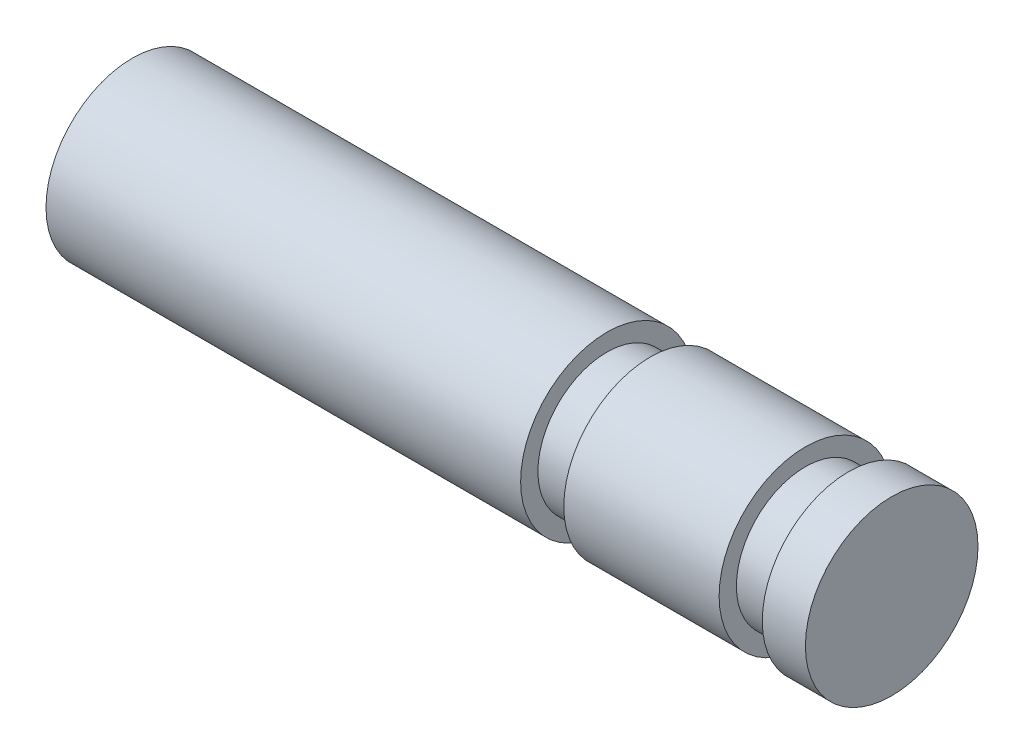
ISO-10303-21;
HEADER;
FILE_DESCRIPTION(('STEP AP214'),'2;1');
FILE_NAME('part.step','',(''),(''),'','','');
FILE_SCHEMA(('AUTOMOTIVE_DESIGN { 1 0 10303 214 1 1 1 1 }'));
ENDSEC;
DATA;
#1=APPLICATION_CONTEXT('core data for automotive mechanical design processes');
#2=APPLICATION_PROTOCOL_DEFINITION('international standard','automotive_design',2000,#1);
#3=PRODUCT_CONTEXT('',#1,'mechanical');
#4=PRODUCT('Part','Part','',(#3));
#5=PRODUCT_RELATED_PRODUCT_CATEGORY('part','',(#4));
#6=PRODUCT_DEFINITION_FORMATION('','',#4);
#7=PRODUCT_DEFINITION_CONTEXT('part definition',#1,'design');
#8=PRODUCT_DEFINITION('design','',#6,#7);
#9=PRODUCT_DEFINITION_SHAPE('','',#8);
#10=(LENGTH_UNIT() NAMED_UNIT(*) SI_UNIT(.MILLI.,.METRE.));
#11=(NAMED_UNIT(*) PLANE_ANGLE_UNIT() SI_UNIT($,.RADIAN.));
#12=(NAMED_UNIT(*) SI_UNIT($,.STERADIAN.) SOLID_ANGLE_UNIT());
#13=UNCERTAINTY_MEASURE_WITH_UNIT(LENGTH_MEASURE(1.E-05),#10,'distance_accuracy_value','');
#14=(GEOMETRIC_REPRESENTATION_CONTEXT(3) GLOBAL_UNCERTAINTY_ASSIGNED_CONTEXT((#13)) GLOBAL_UNIT_ASSIGNED_CONTEXT((#10,
#11,#12)) REPRESENTATION_CONTEXT('',''));
#15=CARTESIAN_POINT('',(0.,0.,0.));
#16=DIRECTION('',(0.,0.,1.));
#17=DIRECTION('',(1.,0.,0.));
#18=AXIS2_PLACEMENT_3D('',#15,#16,#17);
#19=CARTESIAN_POINT('',(-31.2,0.,0.));
#20=DIRECTION('',(1.,0.,0.));
#21=DIRECTION('',(0.,0.,-1.));
#22=AXIS2_PLACEMENT_3D('',#19,#20,#21);
#23=PLANE('',#22);
#24=CARTESIAN_POINT('',(-31.2,0.,0.));
#25=DIRECTION('',(-1.,0.,0.));
#26=DIRECTION('',(0.,0.,1.));
#27=AXIS2_PLACEMENT_3D('',#24,#25,#26);
#28=CIRCLE('',#27,4.);
#29=CARTESIAN_POINT('',(-31.2,0.,4.));
#30=VERTEX_POINT('',#29);
#31=EDGE_CURVE('E10',#30,#30,#28,.T.);
#32=ORIENTED_EDGE('',*,*,#31,.T.);
#33=EDGE_LOOP('',(#32));
#34=FACE_BOUND('',#33,.T.);
#35=ADVANCED_FACE('F31',(#34),#23,.F.);
#36=CARTESIAN_POINT('',(-31.2,0.,0.));
#37=DIRECTION('',(-1.,0.,0.));
#38=DIRECTION('',(0.,0.,1.));
#39=AXIS2_PLACEMENT_3D('',#36,#37,#38);
#40=CYLINDRICAL_SURFACE('',#39,4.);
#41=ORIENTED_EDGE('',*,*,#31,.F.);
#42=EDGE_LOOP('',(#41));
#43=FACE_BOUND('',#42,.T.);
#44=CARTESIAN_POINT('',(-9.2,0.,0.));
#45=DIRECTION('',(-1.,0.,0.));
#46=DIRECTION('',(0.,0.,1.));
#47=AXIS2_PLACEMENT_3D('',#44,#45,#46);
#48=CIRCLE('',#47,4.);
#49=CARTESIAN_POINT('',(-9.2,0.,4.));
#50=VERTEX_POINT('',#49);
#51=EDGE_CURVE('E37',#50,#50,#48,.T.);
#52=ORIENTED_EDGE('',*,*,#51,.T.);
#53=EDGE_LOOP('',(#52));
#54=FACE_BOUND('',#53,.T.);
#55=ADVANCED_FACE('F81',(#43,#54),#40,.T.);
#56=CARTESIAN_POINT('',(-9.2,4.,0.));
#57=DIRECTION('',(-1.,0.,0.));
#58=DIRECTION('',(0.,0.,1.));
#59=AXIS2_PLACEMENT_3D('',#56,#57,#58);
#60=PLANE('',#59);
#61=ORIENTED_EDGE('',*,*,#51,.F.);
#62=EDGE_LOOP('',(#61));
#63=FACE_BOUND('',#62,.T.);
#64=CARTESIAN_POINT('',(-9.2,0.,0.));
#65=DIRECTION('',(-1.,0.,0.));
#66=DIRECTION('',(0.,0.,1.));
#67=AXIS2_PLACEMENT_3D('',#64,#65,#66);
#68=CIRCLE('',#67,3.2);
#69=CARTESIAN_POINT('',(-9.2,0.,3.2));
#70=VERTEX_POINT('',#69);
#71=EDGE_CURVE('E41',#70,#70,#68,.T.);
#72=ORIENTED_EDGE('',*,*,#71,.T.);
#73=EDGE_LOOP('',(#72));
#74=FACE_BOUND('',#73,.T.);
#75=ADVANCED_FACE('F85',(#63,#74),#60,.F.);
#76=CARTESIAN_POINT('',(-31.2,0.,0.));
#77=DIRECTION('',(-1.,0.,0.));
#78=DIRECTION('',(0.,0.,1.));
#79=AXIS2_PLACEMENT_3D('',#76,#77,#78);
#80=CYLINDRICAL_SURFACE('',#79,3.2);
#81=ORIENTED_EDGE('',*,*,#71,.F.);
#82=EDGE_LOOP('',(#81));
#83=FACE_BOUND('',#82,.T.);
#84=CARTESIAN_POINT('',(-7.2,0.,0.));
#85=DIRECTION('',(-1.,0.,0.));
#86=DIRECTION('',(0.,0.,1.));
#87=AXIS2_PLACEMENT_3D('',#84,#85,#86);
#88=CIRCLE('',#87,3.2);
#89=CARTESIAN_POINT('',(-7.2,0.,3.2));
#90=VERTEX_POINT('',#89);
#91=EDGE_CURVE('E45',#90,#90,#88,.T.);
#92=ORIENTED_EDGE('',*,*,#91,.T.);
#93=EDGE_LOOP('',(#92));
#94=FACE_BOUND('',#93,.T.);
#95=ADVANCED_FACE('F90',(#83,#94),#80,.T.);
#96=CARTESIAN_POINT('',(-7.2,3.2,0.));
#97=DIRECTION('',(1.,0.,0.));
#98=DIRECTION('',(0.,0.,-1.));
#99=AXIS2_PLACEMENT_3D('',#96,#97,#98);
#100=PLANE('',#99);
#101=ORIENTED_EDGE('',*,*,#91,.F.);
#102=EDGE_LOOP('',(#101));
#103=FACE_BOUND('',#102,.T.);
#104=CARTESIAN_POINT('',(-7.2,0.,0.));
#105=DIRECTION('',(-1.,0.,0.));
#106=DIRECTION('',(0.,0.,1.));
#107=AXIS2_PLACEMENT_3D('',#104,#105,#106);
#108=CIRCLE('',#107,4.);
#109=CARTESIAN_POINT('',(-7.2,0.,4.));
#110=VERTEX_POINT('',#109);
#111=EDGE_CURVE('E50',#110,#110,#108,.T.);
#112=ORIENTED_EDGE('',*,*,#111,.T.);
#113=EDGE_LOOP('',(#112));
#114=FACE_BOUND('',#113,.T.);
#115=ADVANCED_FACE('F96',(#103,#114),#100,.F.);
#116=CARTESIAN_POINT('',(-31.2,0.,0.));
#117=DIRECTION('',(-1.,0.,0.));
#118=DIRECTION('',(0.,0.,1.));
#119=AXIS2_PLACEMENT_3D('',#116,#117,#118);
#120=CYLINDRICAL_SURFACE('',#119,4.);
#121=ORIENTED_EDGE('',*,*,#111,.F.);
#122=EDGE_LOOP('',(#121));
#123=FACE_BOUND('',#122,.T.);
#124=CARTESIAN_POINT('',(0.,0.,0.));
#125=DIRECTION('',(-1.,0.,0.));
#126=DIRECTION('',(0.,0.,1.));
#127=AXIS2_PLACEMENT_3D('',#124,#125,#126);
#128=CIRCLE('',#127,4.);
#129=CARTESIAN_POINT('',(0.,0.,4.));
#130=VERTEX_POINT('',#129);
#131=EDGE_CURVE('E53',#130,#130,#128,.T.);
#132=ORIENTED_EDGE('',*,*,#131,.T.);
#133=EDGE_LOOP('',(#132));
#134=FACE_BOUND('',#133,.T.);
#135=ADVANCED_FACE('F100',(#123,#134),#120,.T.);
#136=CARTESIAN_POINT('',(0.,4.,0.));
#137=DIRECTION('',(-1.,0.,0.));
#138=DIRECTION('',(0.,0.,1.));
#139=AXIS2_PLACEMENT_3D('',#136,#137,#138);
#140=PLANE('',#139);
#141=ORIENTED_EDGE('',*,*,#131,.F.);
#142=EDGE_LOOP('',(#141));
#143=FACE_BOUND('',#142,.T.);
#144=CARTESIAN_POINT('',(0.,0.,0.));
#145=DIRECTION('',(-1.,0.,0.));
#146=DIRECTION('',(0.,0.,1.));
#147=AXIS2_PLACEMENT_3D('',#144,#145,#146);
#148=CIRCLE('',#147,3.2);
#149=CARTESIAN_POINT('',(0.,0.,3.2));
#150=VERTEX_POINT('',#149);
#151=EDGE_CURVE('E56',#150,#150,#148,.T.);
#152=ORIENTED_EDGE('',*,*,#151,.T.);
#153=EDGE_LOOP('',(#152));
#154=FACE_BOUND('',#153,.T.);
#155=ADVANCED_FACE('F104',(#143,#154),#140,.F.);
#156=CARTESIAN_POINT('',(-31.2,0.,0.));
#157=DIRECTION('',(-1.,0.,0.));
#158=DIRECTION('',(0.,0.,1.));
#159=AXIS2_PLACEMENT_3D('',#156,#157,#158);
#160=CYLINDRICAL_SURFACE('',#159,3.2);
#161=ORIENTED_EDGE('',*,*,#151,.F.);
#162=EDGE_LOOP('',(#161));
#163=FACE_BOUND('',#162,.T.);
#164=CARTESIAN_POINT('',(2.,0.,0.));
#165=DIRECTION('',(-1.,0.,0.));
#166=DIRECTION('',(0.,0.,1.));
#167=AXIS2_PLACEMENT_3D('',#164,#165,#166);
#168=CIRCLE('',#167,3.2);
#169=CARTESIAN_POINT('',(2.,0.,3.2));
#170=VERTEX_POINT('',#169);
#171=EDGE_CURVE('E59',#170,#170,#168,.T.);
#172=ORIENTED_EDGE('',*,*,#171,.T.);
#173=EDGE_LOOP('',(#172));
#174=FACE_BOUND('',#173,.T.);
#175=ADVANCED_FACE('F108',(#163,#174),#160,.T.);
#176=CARTESIAN_POINT('',(2.,3.2,0.));
#177=DIRECTION('',(1.,0.,0.));
#178=DIRECTION('',(0.,0.,-1.));
#179=AXIS2_PLACEMENT_3D('',#176,#177,#178);
#180=PLANE('',#179);
#181=ORIENTED_EDGE('',*,*,#171,.F.);
#182=EDGE_LOOP('',(#181));
#183=FACE_BOUND('',#182,.T.);
#184=CARTESIAN_POINT('',(1.99999999999999,0.,0.));
#185=DIRECTION('',(-1.,0.,0.));
#186=DIRECTION('',(0.,0.,1.));
#187=AXIS2_PLACEMENT_3D('',#184,#185,#186);
#188=CIRCLE('',#187,4.);
#189=CARTESIAN_POINT('',(1.99999999999999,0.,4.));
#190=VERTEX_POINT('',#189);
#191=EDGE_CURVE('E62',#190,#190,#188,.T.);
#192=ORIENTED_EDGE('',*,*,#191,.T.);
#193=EDGE_LOOP('',(#192));
#194=FACE_BOUND('',#193,.T.);
#195=ADVANCED_FACE('F77',(#183,#194),#180,.F.);
#196=CARTESIAN_POINT('',(-31.2,0.,0.));
#197=DIRECTION('',(-1.,0.,0.));
#198=DIRECTION('',(0.,0.,1.));
#199=AXIS2_PLACEMENT_3D('',#196,#197,#198);
#200=CYLINDRICAL_SURFACE('',#199,4.);
#201=ORIENTED_EDGE('',*,*,#191,.F.);
#202=EDGE_LOOP('',(#201));
#203=FACE_BOUND('',#202,.T.);
#204=CARTESIAN_POINT('',(4.,0.,0.));
#205=DIRECTION('',(-1.,0.,0.));
#206=DIRECTION('',(0.,0.,1.));
#207=AXIS2_PLACEMENT_3D('',#204,#205,#206);
#208=CIRCLE('',#207,4.);
#209=CARTESIAN_POINT('',(4.,0.,4.));
#210=VERTEX_POINT('',#209);
#211=EDGE_CURVE('E65',#210,#210,#208,.T.);
#212=ORIENTED_EDGE('',*,*,#211,.T.);
#213=EDGE_LOOP('',(#212));
#214=FACE_BOUND('',#213,.T.);
#215=ADVANCED_FACE('F69',(#203,#214),#200,.T.);
#216=CARTESIAN_POINT('',(4.,4.,0.));
#217=DIRECTION('',(-1.,0.,0.));
#218=DIRECTION('',(0.,0.,1.));
#219=AXIS2_PLACEMENT_3D('',#216,#217,#218);
#220=PLANE('',#219);
#221=ORIENTED_EDGE('',*,*,#211,.F.);
#222=EDGE_LOOP('',(#221));
#223=FACE_BOUND('',#222,.T.);
#224=ADVANCED_FACE('F71',(#223),#220,.F.);
#225=CLOSED_SHELL('',(#35,#55,#75,#95,#115,#135,#155,#175,#195,#215,#224));
#226=MANIFOLD_SOLID_BREP('B2',#225);
#227=ADVANCED_BREP_SHAPE_REPRESENTATION('',(#18,#226),#14);
#228=SHAPE_DEFINITION_REPRESENTATION(#9,#227);
ENDSEC;
END-ISO-10303-21;
